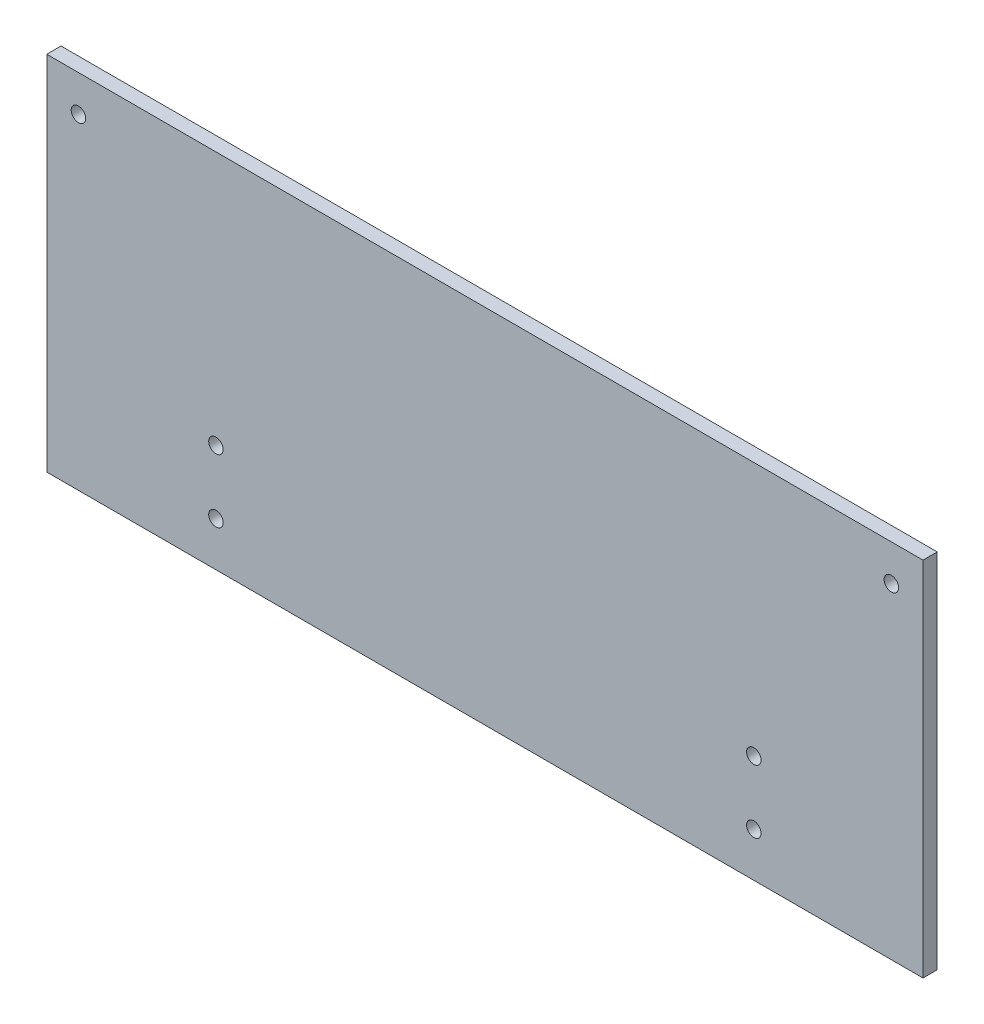
ISO-10303-21;
HEADER;
FILE_DESCRIPTION(('STEP AP214'),'2;1');
FILE_NAME('part.step','',(''),(''),'','','');
FILE_SCHEMA(('AUTOMOTIVE_DESIGN { 1 0 10303 214 1 1 1 1 }'));
ENDSEC;
DATA;
#1=APPLICATION_CONTEXT('core data for automotive mechanical design processes');
#2=APPLICATION_PROTOCOL_DEFINITION('international standard','automotive_design',2000,#1);
#3=PRODUCT_CONTEXT('',#1,'mechanical');
#4=PRODUCT('Part','Part','',(#3));
#5=PRODUCT_RELATED_PRODUCT_CATEGORY('part','',(#4));
#6=PRODUCT_DEFINITION_FORMATION('','',#4);
#7=PRODUCT_DEFINITION_CONTEXT('part definition',#1,'design');
#8=PRODUCT_DEFINITION('design','',#6,#7);
#9=PRODUCT_DEFINITION_SHAPE('','',#8);
#10=(LENGTH_UNIT() NAMED_UNIT(*) SI_UNIT(.MILLI.,.METRE.));
#11=(NAMED_UNIT(*) PLANE_ANGLE_UNIT() SI_UNIT($,.RADIAN.));
#12=(NAMED_UNIT(*) SI_UNIT($,.STERADIAN.) SOLID_ANGLE_UNIT());
#13=UNCERTAINTY_MEASURE_WITH_UNIT(LENGTH_MEASURE(1.E-05),#10,'distance_accuracy_value','');
#14=(GEOMETRIC_REPRESENTATION_CONTEXT(3) GLOBAL_UNCERTAINTY_ASSIGNED_CONTEXT((#13)) GLOBAL_UNIT_ASSIGNED_CONTEXT((#10,
#11,#12)) REPRESENTATION_CONTEXT('',''));
#15=CARTESIAN_POINT('',(0.,0.,0.));
#16=DIRECTION('',(0.,0.,1.));
#17=DIRECTION('',(1.,0.,0.));
#18=AXIS2_PLACEMENT_3D('',#15,#16,#17);
#19=CARTESIAN_POINT('',(0.,0.,4.));
#20=DIRECTION('',(0.,0.,-1.));
#21=DIRECTION('',(-1.,0.,0.));
#22=AXIS2_PLACEMENT_3D('',#19,#20,#21);
#23=PLANE('',#22);
#24=DIRECTION('',(0.,-1.,0.));
#25=VECTOR('',#24,1.);
#26=CARTESIAN_POINT('',(4.,0.,4.));
#27=LINE('',#26,#25);
#28=CARTESIAN_POINT('',(4.,101.6,4.));
#29=VERTEX_POINT('',#28);
#30=CARTESIAN_POINT('',(4.,0.,4.));
#31=VERTEX_POINT('',#30);
#32=EDGE_CURVE('E96',#29,#31,#27,.T.);
#33=ORIENTED_EDGE('',*,*,#32,.T.);
#34=DIRECTION('',(1.,0.,0.));
#35=VECTOR('',#34,1.);
#36=CARTESIAN_POINT('',(127.,0.,4.));
#37=LINE('',#36,#35);
#38=CARTESIAN_POINT('',(250.,0.,4.));
#39=VERTEX_POINT('',#38);
#40=EDGE_CURVE('E91',#31,#39,#37,.T.);
#41=ORIENTED_EDGE('',*,*,#40,.T.);
#42=DIRECTION('',(0.,1.,0.));
#43=VECTOR('',#42,1.);
#44=CARTESIAN_POINT('',(250.,0.,4.));
#45=LINE('',#44,#43);
#46=CARTESIAN_POINT('',(250.,101.6,4.));
#47=VERTEX_POINT('',#46);
#48=EDGE_CURVE('E94',#39,#47,#45,.T.);
#49=ORIENTED_EDGE('',*,*,#48,.T.);
#50=DIRECTION('',(-1.,0.,0.));
#51=VECTOR('',#50,1.);
#52=CARTESIAN_POINT('',(4.,101.6,4.));
#53=LINE('',#52,#51);
#54=EDGE_CURVE('E61',#47,#29,#53,.T.);
#55=ORIENTED_EDGE('',*,*,#54,.T.);
#56=EDGE_LOOP('',(#33,#41,#49,#55));
#57=FACE_BOUND('',#56,.T.);
#58=CARTESIAN_POINT('',(202.502,30.226,4.));
#59=DIRECTION('',(0.,0.,1.));
#60=DIRECTION('',(1.,0.,0.));
#61=AXIS2_PLACEMENT_3D('',#58,#59,#60);
#62=CIRCLE('',#61,2.03200000000001);
#63=CARTESIAN_POINT('',(204.534,30.226,4.));
#64=VERTEX_POINT('',#63);
#65=EDGE_CURVE('E116',#64,#64,#62,.T.);
#66=ORIENTED_EDGE('',*,*,#65,.F.);
#67=EDGE_LOOP('',(#66));
#68=FACE_BOUND('',#67,.T.);
#69=CARTESIAN_POINT('',(51.498,12.446,4.));
#70=DIRECTION('',(0.,0.,1.));
#71=DIRECTION('',(-1.,0.,0.));
#72=AXIS2_PLACEMENT_3D('',#69,#70,#71);
#73=CIRCLE('',#72,2.032);
#74=CARTESIAN_POINT('',(49.466,12.446,4.));
#75=VERTEX_POINT('',#74);
#76=EDGE_CURVE('E138',#75,#75,#73,.T.);
#77=ORIENTED_EDGE('',*,*,#76,.F.);
#78=EDGE_LOOP('',(#77));
#79=FACE_BOUND('',#78,.T.);
#80=CARTESIAN_POINT('',(202.502,12.446,4.));
#81=DIRECTION('',(0.,0.,1.));
#82=DIRECTION('',(1.,0.,0.));
#83=AXIS2_PLACEMENT_3D('',#80,#81,#82);
#84=CIRCLE('',#83,2.03200000000001);
#85=CARTESIAN_POINT('',(204.534,12.446,4.));
#86=VERTEX_POINT('',#85);
#87=EDGE_CURVE('E146',#86,#86,#84,.T.);
#88=ORIENTED_EDGE('',*,*,#87,.F.);
#89=EDGE_LOOP('',(#88));
#90=FACE_BOUND('',#89,.T.);
#91=CARTESIAN_POINT('',(241.11,91.44,4.));
#92=DIRECTION('',(0.,0.,1.));
#93=DIRECTION('',(1.,0.,0.));
#94=AXIS2_PLACEMENT_3D('',#91,#92,#93);
#95=CIRCLE('',#94,2.03200000000001);
#96=CARTESIAN_POINT('',(243.142,91.44,4.));
#97=VERTEX_POINT('',#96);
#98=EDGE_CURVE('E154',#97,#97,#95,.T.);
#99=ORIENTED_EDGE('',*,*,#98,.F.);
#100=EDGE_LOOP('',(#99));
#101=FACE_BOUND('',#100,.T.);
#102=CARTESIAN_POINT('',(12.89,91.4400000000001,4.));
#103=DIRECTION('',(0.,0.,1.));
#104=DIRECTION('',(1.,0.,0.));
#105=AXIS2_PLACEMENT_3D('',#102,#103,#104);
#106=CIRCLE('',#105,2.032);
#107=CARTESIAN_POINT('',(14.922,91.4400000000001,4.));
#108=VERTEX_POINT('',#107);
#109=EDGE_CURVE('E162',#108,#108,#106,.T.);
#110=ORIENTED_EDGE('',*,*,#109,.F.);
#111=EDGE_LOOP('',(#110));
#112=FACE_BOUND('',#111,.T.);
#113=CARTESIAN_POINT('',(51.498,30.226,4.));
#114=DIRECTION('',(0.,0.,1.));
#115=DIRECTION('',(-1.,0.,0.));
#116=AXIS2_PLACEMENT_3D('',#113,#114,#115);
#117=CIRCLE('',#116,2.032);
#118=CARTESIAN_POINT('',(49.466,30.226,4.));
#119=VERTEX_POINT('',#118);
#120=EDGE_CURVE('E170',#119,#119,#117,.T.);
#121=ORIENTED_EDGE('',*,*,#120,.F.);
#122=EDGE_LOOP('',(#121));
#123=FACE_BOUND('',#122,.T.);
#124=ADVANCED_FACE('F43',(#57,#68,#79,#90,#101,#112,#123),#23,.F.);
#125=CARTESIAN_POINT('',(0.,0.,0.));
#126=DIRECTION('',(0.,0.,-1.));
#127=DIRECTION('',(-1.,0.,0.));
#128=AXIS2_PLACEMENT_3D('',#125,#126,#127);
#129=PLANE('',#128);
#130=CARTESIAN_POINT('',(12.89,91.4400000000001,0.));
#131=DIRECTION('',(0.,0.,1.));
#132=DIRECTION('',(1.,0.,0.));
#133=AXIS2_PLACEMENT_3D('',#130,#131,#132);
#134=CIRCLE('',#133,2.032);
#135=CARTESIAN_POINT('',(14.922,91.4400000000001,0.));
#136=VERTEX_POINT('',#135);
#137=EDGE_CURVE('E166',#136,#136,#134,.T.);
#138=ORIENTED_EDGE('',*,*,#137,.T.);
#139=EDGE_LOOP('',(#138));
#140=FACE_BOUND('',#139,.T.);
#141=CARTESIAN_POINT('',(202.502,12.446,0.));
#142=DIRECTION('',(0.,0.,1.));
#143=DIRECTION('',(1.,0.,0.));
#144=AXIS2_PLACEMENT_3D('',#141,#142,#143);
#145=CIRCLE('',#144,2.03200000000001);
#146=CARTESIAN_POINT('',(204.534,12.446,0.));
#147=VERTEX_POINT('',#146);
#148=EDGE_CURVE('E150',#147,#147,#145,.T.);
#149=ORIENTED_EDGE('',*,*,#148,.T.);
#150=EDGE_LOOP('',(#149));
#151=FACE_BOUND('',#150,.T.);
#152=CARTESIAN_POINT('',(202.502,30.226,0.));
#153=DIRECTION('',(0.,0.,1.));
#154=DIRECTION('',(1.,0.,0.));
#155=AXIS2_PLACEMENT_3D('',#152,#153,#154);
#156=CIRCLE('',#155,2.03200000000001);
#157=CARTESIAN_POINT('',(204.534,30.226,0.));
#158=VERTEX_POINT('',#157);
#159=EDGE_CURVE('E134',#158,#158,#156,.T.);
#160=ORIENTED_EDGE('',*,*,#159,.T.);
#161=EDGE_LOOP('',(#160));
#162=FACE_BOUND('',#161,.T.);
#163=DIRECTION('',(0.,-1.,0.));
#164=VECTOR('',#163,1.);
#165=CARTESIAN_POINT('',(4.,0.,0.));
#166=LINE('',#165,#164);
#167=CARTESIAN_POINT('',(4.,101.6,0.));
#168=VERTEX_POINT('',#167);
#169=CARTESIAN_POINT('',(4.,0.,0.));
#170=VERTEX_POINT('',#169);
#171=EDGE_CURVE('E112',#168,#170,#166,.T.);
#172=ORIENTED_EDGE('',*,*,#171,.F.);
#173=DIRECTION('',(-1.,0.,0.));
#174=VECTOR('',#173,1.);
#175=CARTESIAN_POINT('',(4.,101.6,0.));
#176=LINE('',#175,#174);
#177=CARTESIAN_POINT('',(250.,101.6,0.));
#178=VERTEX_POINT('',#177);
#179=EDGE_CURVE('E84',#178,#168,#176,.T.);
#180=ORIENTED_EDGE('',*,*,#179,.F.);
#181=DIRECTION('',(0.,1.,0.));
#182=VECTOR('',#181,1.);
#183=CARTESIAN_POINT('',(250.,0.,0.));
#184=LINE('',#183,#182);
#185=CARTESIAN_POINT('',(250.,0.,0.));
#186=VERTEX_POINT('',#185);
#187=EDGE_CURVE('E78',#186,#178,#184,.T.);
#188=ORIENTED_EDGE('',*,*,#187,.F.);
#189=DIRECTION('',(1.,0.,0.));
#190=VECTOR('',#189,1.);
#191=CARTESIAN_POINT('',(127.,0.,0.));
#192=LINE('',#191,#190);
#193=EDGE_CURVE('E101',#170,#186,#192,.T.);
#194=ORIENTED_EDGE('',*,*,#193,.F.);
#195=EDGE_LOOP('',(#172,#180,#188,#194));
#196=FACE_BOUND('',#195,.T.);
#197=CARTESIAN_POINT('',(51.498,12.446,0.));
#198=DIRECTION('',(0.,0.,1.));
#199=DIRECTION('',(-1.,0.,0.));
#200=AXIS2_PLACEMENT_3D('',#197,#198,#199);
#201=CIRCLE('',#200,2.032);
#202=CARTESIAN_POINT('',(49.466,12.446,0.));
#203=VERTEX_POINT('',#202);
#204=EDGE_CURVE('E142',#203,#203,#201,.T.);
#205=ORIENTED_EDGE('',*,*,#204,.T.);
#206=EDGE_LOOP('',(#205));
#207=FACE_BOUND('',#206,.T.);
#208=CARTESIAN_POINT('',(241.11,91.44,0.));
#209=DIRECTION('',(0.,0.,1.));
#210=DIRECTION('',(1.,0.,0.));
#211=AXIS2_PLACEMENT_3D('',#208,#209,#210);
#212=CIRCLE('',#211,2.03200000000001);
#213=CARTESIAN_POINT('',(243.142,91.44,0.));
#214=VERTEX_POINT('',#213);
#215=EDGE_CURVE('E158',#214,#214,#212,.T.);
#216=ORIENTED_EDGE('',*,*,#215,.T.);
#217=EDGE_LOOP('',(#216));
#218=FACE_BOUND('',#217,.T.);
#219=CARTESIAN_POINT('',(51.498,30.226,0.));
#220=DIRECTION('',(0.,0.,1.));
#221=DIRECTION('',(-1.,0.,0.));
#222=AXIS2_PLACEMENT_3D('',#219,#220,#221);
#223=CIRCLE('',#222,2.032);
#224=CARTESIAN_POINT('',(49.466,30.226,0.));
#225=VERTEX_POINT('',#224);
#226=EDGE_CURVE('E174',#225,#225,#223,.T.);
#227=ORIENTED_EDGE('',*,*,#226,.T.);
#228=EDGE_LOOP('',(#227));
#229=FACE_BOUND('',#228,.T.);
#230=ADVANCED_FACE('F129',(#140,#151,#162,#196,#207,#218,#229),#129,.T.);
#231=CARTESIAN_POINT('',(4.,0.,4.));
#232=DIRECTION('',(1.,0.,0.));
#233=DIRECTION('',(0.,0.,-1.));
#234=AXIS2_PLACEMENT_3D('',#231,#232,#233);
#235=PLANE('',#234);
#236=ORIENTED_EDGE('',*,*,#171,.T.);
#237=DIRECTION('',(0.,0.,-1.));
#238=VECTOR('',#237,1.);
#239=CARTESIAN_POINT('',(4.,0.,4.));
#240=LINE('',#239,#238);
#241=EDGE_CURVE('E11',#31,#170,#240,.T.);
#242=ORIENTED_EDGE('',*,*,#241,.F.);
#243=ORIENTED_EDGE('',*,*,#32,.F.);
#244=DIRECTION('',(0.,0.,-1.));
#245=VECTOR('',#244,1.);
#246=CARTESIAN_POINT('',(4.,101.6,4.));
#247=LINE('',#246,#245);
#248=EDGE_CURVE('E108',#29,#168,#247,.T.);
#249=ORIENTED_EDGE('',*,*,#248,.T.);
#250=EDGE_LOOP('',(#236,#242,#243,#249));
#251=FACE_BOUND('',#250,.T.);
#252=ADVANCED_FACE('F45',(#251),#235,.F.);
#253=CARTESIAN_POINT('',(127.,0.,4.));
#254=DIRECTION('',(0.,1.,0.));
#255=DIRECTION('',(0.,0.,1.));
#256=AXIS2_PLACEMENT_3D('',#253,#254,#255);
#257=PLANE('',#256);
#258=ORIENTED_EDGE('',*,*,#193,.T.);
#259=DIRECTION('',(0.,0.,-1.));
#260=VECTOR('',#259,1.);
#261=CARTESIAN_POINT('',(250.,0.,4.));
#262=LINE('',#261,#260);
#263=EDGE_CURVE('E53',#39,#186,#262,.T.);
#264=ORIENTED_EDGE('',*,*,#263,.F.);
#265=ORIENTED_EDGE('',*,*,#40,.F.);
#266=ORIENTED_EDGE('',*,*,#241,.T.);
#267=EDGE_LOOP('',(#258,#264,#265,#266));
#268=FACE_BOUND('',#267,.T.);
#269=ADVANCED_FACE('F100',(#268),#257,.F.);
#270=CARTESIAN_POINT('',(250.,0.,4.));
#271=DIRECTION('',(-1.,0.,0.));
#272=DIRECTION('',(0.,0.,1.));
#273=AXIS2_PLACEMENT_3D('',#270,#271,#272);
#274=PLANE('',#273);
#275=ORIENTED_EDGE('',*,*,#187,.T.);
#276=DIRECTION('',(0.,0.,-1.));
#277=VECTOR('',#276,1.);
#278=CARTESIAN_POINT('',(250.,101.6,4.));
#279=LINE('',#278,#277);
#280=EDGE_CURVE('E103',#47,#178,#279,.T.);
#281=ORIENTED_EDGE('',*,*,#280,.F.);
#282=ORIENTED_EDGE('',*,*,#48,.F.);
#283=ORIENTED_EDGE('',*,*,#263,.T.);
#284=EDGE_LOOP('',(#275,#281,#282,#283));
#285=FACE_BOUND('',#284,.T.);
#286=ADVANCED_FACE('F104',(#285),#274,.F.);
#287=CARTESIAN_POINT('',(4.,101.6,4.));
#288=DIRECTION('',(0.,-1.,0.));
#289=DIRECTION('',(0.,0.,-1.));
#290=AXIS2_PLACEMENT_3D('',#287,#288,#289);
#291=PLANE('',#290);
#292=ORIENTED_EDGE('',*,*,#179,.T.);
#293=ORIENTED_EDGE('',*,*,#248,.F.);
#294=ORIENTED_EDGE('',*,*,#54,.F.);
#295=ORIENTED_EDGE('',*,*,#280,.T.);
#296=EDGE_LOOP('',(#292,#293,#294,#295));
#297=FACE_BOUND('',#296,.T.);
#298=ADVANCED_FACE('F126',(#297),#291,.F.);
#299=CARTESIAN_POINT('',(202.502,30.226,4.));
#300=DIRECTION('',(0.,0.,-1.));
#301=DIRECTION('',(-1.,0.,0.));
#302=AXIS2_PLACEMENT_3D('',#299,#300,#301);
#303=CYLINDRICAL_SURFACE('',#302,2.03200000000001);
#304=ORIENTED_EDGE('',*,*,#65,.T.);
#305=EDGE_LOOP('',(#304));
#306=FACE_BOUND('',#305,.T.);
#307=ORIENTED_EDGE('',*,*,#159,.F.);
#308=EDGE_LOOP('',(#307));
#309=FACE_BOUND('',#308,.T.);
#310=ADVANCED_FACE('F193',(#306,#309),#303,.F.);
#311=CARTESIAN_POINT('',(51.498,12.446,4.));
#312=DIRECTION('',(0.,0.,-1.));
#313=DIRECTION('',(-1.,0.,0.));
#314=AXIS2_PLACEMENT_3D('',#311,#312,#313);
#315=CYLINDRICAL_SURFACE('',#314,2.032);
#316=ORIENTED_EDGE('',*,*,#76,.T.);
#317=EDGE_LOOP('',(#316));
#318=FACE_BOUND('',#317,.T.);
#319=ORIENTED_EDGE('',*,*,#204,.F.);
#320=EDGE_LOOP('',(#319));
#321=FACE_BOUND('',#320,.T.);
#322=ADVANCED_FACE('F248',(#318,#321),#315,.F.);
#323=CARTESIAN_POINT('',(202.502,12.446,4.));
#324=DIRECTION('',(0.,0.,-1.));
#325=DIRECTION('',(-1.,0.,0.));
#326=AXIS2_PLACEMENT_3D('',#323,#324,#325);
#327=CYLINDRICAL_SURFACE('',#326,2.03200000000001);
#328=ORIENTED_EDGE('',*,*,#87,.T.);
#329=EDGE_LOOP('',(#328));
#330=FACE_BOUND('',#329,.T.);
#331=ORIENTED_EDGE('',*,*,#148,.F.);
#332=EDGE_LOOP('',(#331));
#333=FACE_BOUND('',#332,.T.);
#334=ADVANCED_FACE('F257',(#330,#333),#327,.F.);
#335=CARTESIAN_POINT('',(241.11,91.44,4.));
#336=DIRECTION('',(0.,0.,-1.));
#337=DIRECTION('',(-1.,0.,0.));
#338=AXIS2_PLACEMENT_3D('',#335,#336,#337);
#339=CYLINDRICAL_SURFACE('',#338,2.03200000000001);
#340=ORIENTED_EDGE('',*,*,#98,.T.);
#341=EDGE_LOOP('',(#340));
#342=FACE_BOUND('',#341,.T.);
#343=ORIENTED_EDGE('',*,*,#215,.F.);
#344=EDGE_LOOP('',(#343));
#345=FACE_BOUND('',#344,.T.);
#346=ADVANCED_FACE('F266',(#342,#345),#339,.F.);
#347=CARTESIAN_POINT('',(12.89,91.4400000000001,4.));
#348=DIRECTION('',(0.,0.,-1.));
#349=DIRECTION('',(-1.,0.,0.));
#350=AXIS2_PLACEMENT_3D('',#347,#348,#349);
#351=CYLINDRICAL_SURFACE('',#350,2.032);
#352=ORIENTED_EDGE('',*,*,#109,.T.);
#353=EDGE_LOOP('',(#352));
#354=FACE_BOUND('',#353,.T.);
#355=ORIENTED_EDGE('',*,*,#137,.F.);
#356=EDGE_LOOP('',(#355));
#357=FACE_BOUND('',#356,.T.);
#358=ADVANCED_FACE('F276',(#354,#357),#351,.F.);
#359=CARTESIAN_POINT('',(51.498,30.226,4.));
#360=DIRECTION('',(0.,0.,-1.));
#361=DIRECTION('',(-1.,0.,0.));
#362=AXIS2_PLACEMENT_3D('',#359,#360,#361);
#363=CYLINDRICAL_SURFACE('',#362,2.032);
#364=ORIENTED_EDGE('',*,*,#120,.T.);
#365=EDGE_LOOP('',(#364));
#366=FACE_BOUND('',#365,.T.);
#367=ORIENTED_EDGE('',*,*,#226,.F.);
#368=EDGE_LOOP('',(#367));
#369=FACE_BOUND('',#368,.T.);
#370=ADVANCED_FACE('F182',(#366,#369),#363,.F.);
#371=CLOSED_SHELL('',(#124,#230,#252,#269,#286,#298,#310,#322,#334,#346,#358,#370));
#372=MANIFOLD_SOLID_BREP('B2',#371);
#373=ADVANCED_BREP_SHAPE_REPRESENTATION('',(#18,#372),#14);
#374=SHAPE_DEFINITION_REPRESENTATION(#9,#373);
ENDSEC;
END-ISO-10303-21;
